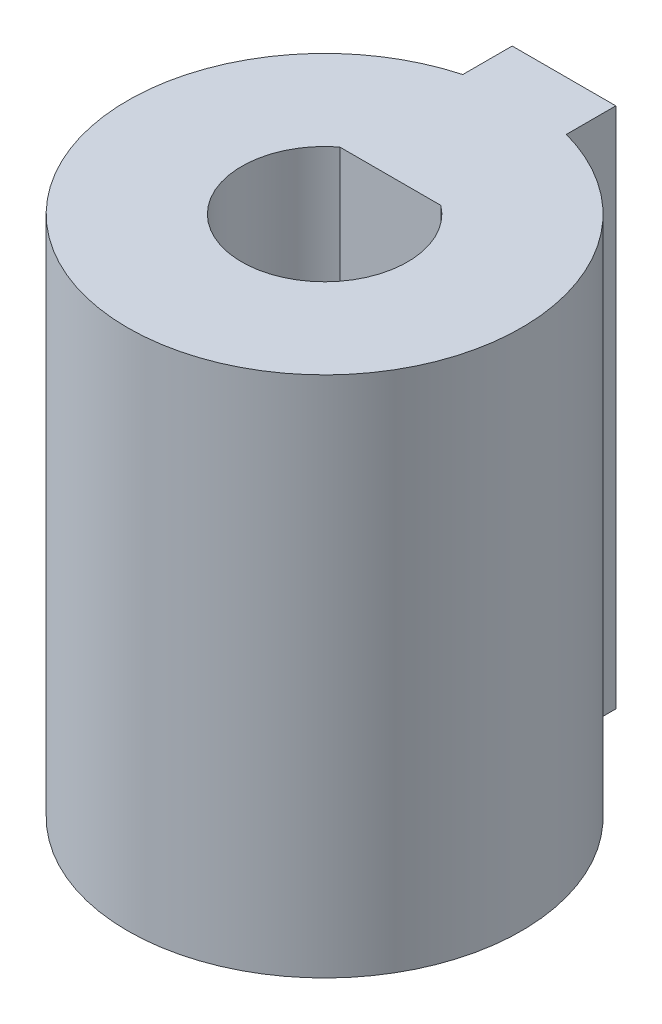
ISO-10303-21;
HEADER;
FILE_DESCRIPTION(('STEP AP214'),'2;1');
FILE_NAME('part.step','',(''),(''),'','','');
FILE_SCHEMA(('AUTOMOTIVE_DESIGN { 1 0 10303 214 1 1 1 1 }'));
ENDSEC;
DATA;
#1=APPLICATION_CONTEXT('core data for automotive mechanical design processes');
#2=APPLICATION_PROTOCOL_DEFINITION('international standard','automotive_design',2000,#1);
#3=PRODUCT_CONTEXT('',#1,'mechanical');
#4=PRODUCT('Part','Part','',(#3));
#5=PRODUCT_RELATED_PRODUCT_CATEGORY('part','',(#4));
#6=PRODUCT_DEFINITION_FORMATION('','',#4);
#7=PRODUCT_DEFINITION_CONTEXT('part definition',#1,'design');
#8=PRODUCT_DEFINITION('design','',#6,#7);
#9=PRODUCT_DEFINITION_SHAPE('','',#8);
#10=(LENGTH_UNIT() NAMED_UNIT(*) SI_UNIT(.MILLI.,.METRE.));
#11=(NAMED_UNIT(*) PLANE_ANGLE_UNIT() SI_UNIT($,.RADIAN.));
#12=(NAMED_UNIT(*) SI_UNIT($,.STERADIAN.) SOLID_ANGLE_UNIT());
#13=UNCERTAINTY_MEASURE_WITH_UNIT(LENGTH_MEASURE(1.E-05),#10,'distance_accuracy_value','');
#14=(GEOMETRIC_REPRESENTATION_CONTEXT(3) GLOBAL_UNCERTAINTY_ASSIGNED_CONTEXT((#13)) GLOBAL_UNIT_ASSIGNED_CONTEXT((#10,
#11,#12)) REPRESENTATION_CONTEXT('',''));
#15=CARTESIAN_POINT('',(0.,0.,0.));
#16=DIRECTION('',(0.,0.,1.));
#17=DIRECTION('',(1.,0.,0.));
#18=AXIS2_PLACEMENT_3D('',#15,#16,#17);
#19=CARTESIAN_POINT('',(0.,25.2,0.));
#20=DIRECTION('',(0.,1.,0.));
#21=DIRECTION('',(0.,0.,1.));
#22=AXIS2_PLACEMENT_3D('',#19,#20,#21);
#23=PLANE('',#22);
#24=DIRECTION('',(0.,0.,1.));
#25=VECTOR('',#24,1.);
#26=CARTESIAN_POINT('',(-2.5,25.2,-11.55));
#27=LINE('',#26,#25);
#28=CARTESIAN_POINT('',(-2.5,25.2,-11.55));
#29=VERTEX_POINT('',#28);
#30=CARTESIAN_POINT('',(-2.5,25.2,-9.16515138991168));
#31=VERTEX_POINT('',#30);
#32=EDGE_CURVE('E110',#29,#31,#27,.T.);
#33=ORIENTED_EDGE('',*,*,#32,.T.);
#34=CARTESIAN_POINT('',(0.,25.2,0.));
#35=DIRECTION('',(0.,1.,0.));
#36=DIRECTION('',(0.,0.,1.));
#37=AXIS2_PLACEMENT_3D('',#34,#35,#36);
#38=CIRCLE('',#37,9.5);
#39=CARTESIAN_POINT('',(2.5,25.2,-9.16515138991168));
#40=VERTEX_POINT('',#39);
#41=EDGE_CURVE('E113',#31,#40,#38,.T.);
#42=ORIENTED_EDGE('',*,*,#41,.T.);
#43=DIRECTION('',(0.,0.,-1.));
#44=VECTOR('',#43,1.);
#45=CARTESIAN_POINT('',(2.5,25.2,-11.55));
#46=LINE('',#45,#44);
#47=CARTESIAN_POINT('',(2.5,25.2,-11.55));
#48=VERTEX_POINT('',#47);
#49=EDGE_CURVE('E116',#40,#48,#46,.T.);
#50=ORIENTED_EDGE('',*,*,#49,.T.);
#51=DIRECTION('',(-1.,0.,0.));
#52=VECTOR('',#51,1.);
#53=CARTESIAN_POINT('',(-2.5,25.2,-11.55));
#54=LINE('',#53,#52);
#55=EDGE_CURVE('E118',#48,#29,#54,.T.);
#56=ORIENTED_EDGE('',*,*,#55,.T.);
#57=EDGE_LOOP('',(#33,#42,#50,#56));
#58=FACE_BOUND('',#57,.T.);
#59=DIRECTION('',(-1.,0.,0.));
#60=VECTOR('',#59,1.);
#61=CARTESIAN_POINT('',(-2.43948765112677,25.2,-3.17));
#62=LINE('',#61,#60);
#63=CARTESIAN_POINT('',(2.43948765112677,25.2,-3.17));
#64=VERTEX_POINT('',#63);
#65=CARTESIAN_POINT('',(-2.43948765112677,25.2,-3.17));
#66=VERTEX_POINT('',#65);
#67=EDGE_CURVE('E93',#64,#66,#62,.T.);
#68=ORIENTED_EDGE('',*,*,#67,.F.);
#69=CARTESIAN_POINT('',(0.,25.2,0.));
#70=DIRECTION('',(0.,1.,0.));
#71=DIRECTION('',(0.,0.,1.));
#72=AXIS2_PLACEMENT_3D('',#69,#70,#71);
#73=CIRCLE('',#72,4.);
#74=EDGE_CURVE('E99',#66,#64,#73,.T.);
#75=ORIENTED_EDGE('',*,*,#74,.F.);
#76=EDGE_LOOP('',(#68,#75));
#77=FACE_BOUND('',#76,.T.);
#78=ADVANCED_FACE('F41',(#58,#77),#23,.T.);
#79=CARTESIAN_POINT('',(0.,0.,0.));
#80=DIRECTION('',(0.,1.,0.));
#81=DIRECTION('',(0.,0.,1.));
#82=AXIS2_PLACEMENT_3D('',#79,#80,#81);
#83=PLANE('',#82);
#84=DIRECTION('',(0.,0.,1.));
#85=VECTOR('',#84,1.);
#86=CARTESIAN_POINT('',(-2.5,0.,-11.55));
#87=LINE('',#86,#85);
#88=CARTESIAN_POINT('',(-2.5,0.,-11.55));
#89=VERTEX_POINT('',#88);
#90=CARTESIAN_POINT('',(-2.5,0.,-9.16515138991168));
#91=VERTEX_POINT('',#90);
#92=EDGE_CURVE('E109',#89,#91,#87,.T.);
#93=ORIENTED_EDGE('',*,*,#92,.F.);
#94=DIRECTION('',(-1.,0.,0.));
#95=VECTOR('',#94,1.);
#96=CARTESIAN_POINT('',(-2.5,0.,-11.55));
#97=LINE('',#96,#95);
#98=CARTESIAN_POINT('',(2.5,0.,-11.55));
#99=VERTEX_POINT('',#98);
#100=EDGE_CURVE('E114',#99,#89,#97,.T.);
#101=ORIENTED_EDGE('',*,*,#100,.F.);
#102=DIRECTION('',(0.,0.,-1.));
#103=VECTOR('',#102,1.);
#104=CARTESIAN_POINT('',(2.5,0.,-11.55));
#105=LINE('',#104,#103);
#106=CARTESIAN_POINT('',(2.5,0.,-9.16515138991168));
#107=VERTEX_POINT('',#106);
#108=EDGE_CURVE('E125',#107,#99,#105,.T.);
#109=ORIENTED_EDGE('',*,*,#108,.F.);
#110=CARTESIAN_POINT('',(0.,0.,0.));
#111=DIRECTION('',(0.,1.,0.));
#112=DIRECTION('',(0.,0.,1.));
#113=AXIS2_PLACEMENT_3D('',#110,#111,#112);
#114=CIRCLE('',#113,9.5);
#115=EDGE_CURVE('E123',#91,#107,#114,.T.);
#116=ORIENTED_EDGE('',*,*,#115,.F.);
#117=EDGE_LOOP('',(#93,#101,#109,#116));
#118=FACE_BOUND('',#117,.T.);
#119=CARTESIAN_POINT('',(0.,0.,0.));
#120=DIRECTION('',(0.,1.,0.));
#121=DIRECTION('',(0.,0.,1.));
#122=AXIS2_PLACEMENT_3D('',#119,#120,#121);
#123=CIRCLE('',#122,4.);
#124=CARTESIAN_POINT('',(-2.43948765112677,0.,-3.17));
#125=VERTEX_POINT('',#124);
#126=CARTESIAN_POINT('',(2.43948765112677,0.,-3.17));
#127=VERTEX_POINT('',#126);
#128=EDGE_CURVE('E63',#125,#127,#123,.T.);
#129=ORIENTED_EDGE('',*,*,#128,.T.);
#130=DIRECTION('',(-1.,0.,0.));
#131=VECTOR('',#130,1.);
#132=CARTESIAN_POINT('',(-2.43948765112677,0.,-3.17));
#133=LINE('',#132,#131);
#134=EDGE_CURVE('E103',#127,#125,#133,.T.);
#135=ORIENTED_EDGE('',*,*,#134,.T.);
#136=EDGE_LOOP('',(#129,#135));
#137=FACE_BOUND('',#136,.T.);
#138=ADVANCED_FACE('F143',(#118,#137),#83,.F.);
#139=CARTESIAN_POINT('',(-2.5,25.2,-11.55));
#140=DIRECTION('',(1.,0.,0.));
#141=DIRECTION('',(0.,0.,-1.));
#142=AXIS2_PLACEMENT_3D('',#139,#140,#141);
#143=PLANE('',#142);
#144=ORIENTED_EDGE('',*,*,#92,.T.);
#145=DIRECTION('',(0.,-1.,0.));
#146=VECTOR('',#145,1.);
#147=CARTESIAN_POINT('',(-2.5,25.2,-9.16515138991168));
#148=LINE('',#147,#146);
#149=EDGE_CURVE('E11',#31,#91,#148,.T.);
#150=ORIENTED_EDGE('',*,*,#149,.F.);
#151=ORIENTED_EDGE('',*,*,#32,.F.);
#152=DIRECTION('',(0.,-1.,0.));
#153=VECTOR('',#152,1.);
#154=CARTESIAN_POINT('',(-2.5,25.2,-11.55));
#155=LINE('',#154,#153);
#156=EDGE_CURVE('E120',#29,#89,#155,.T.);
#157=ORIENTED_EDGE('',*,*,#156,.T.);
#158=EDGE_LOOP('',(#144,#150,#151,#157));
#159=FACE_BOUND('',#158,.T.);
#160=ADVANCED_FACE('F43',(#159),#143,.F.);
#161=CARTESIAN_POINT('',(0.,25.2,0.));
#162=DIRECTION('',(0.,-1.,0.));
#163=DIRECTION('',(0.,0.,-1.));
#164=AXIS2_PLACEMENT_3D('',#161,#162,#163);
#165=CYLINDRICAL_SURFACE('',#164,9.5);
#166=ORIENTED_EDGE('',*,*,#115,.T.);
#167=DIRECTION('',(0.,-1.,0.));
#168=VECTOR('',#167,1.);
#169=CARTESIAN_POINT('',(2.5,25.2,-9.16515138991168));
#170=LINE('',#169,#168);
#171=EDGE_CURVE('E49',#40,#107,#170,.T.);
#172=ORIENTED_EDGE('',*,*,#171,.F.);
#173=ORIENTED_EDGE('',*,*,#41,.F.);
#174=ORIENTED_EDGE('',*,*,#149,.T.);
#175=EDGE_LOOP('',(#166,#172,#173,#174));
#176=FACE_BOUND('',#175,.T.);
#177=ADVANCED_FACE('F153',(#176),#165,.T.);
#178=CARTESIAN_POINT('',(2.5,25.2,-11.55));
#179=DIRECTION('',(-1.,0.,0.));
#180=DIRECTION('',(0.,0.,1.));
#181=AXIS2_PLACEMENT_3D('',#178,#179,#180);
#182=PLANE('',#181);
#183=ORIENTED_EDGE('',*,*,#108,.T.);
#184=DIRECTION('',(0.,-1.,0.));
#185=VECTOR('',#184,1.);
#186=CARTESIAN_POINT('',(2.5,25.2,-11.55));
#187=LINE('',#186,#185);
#188=EDGE_CURVE('E130',#48,#99,#187,.T.);
#189=ORIENTED_EDGE('',*,*,#188,.F.);
#190=ORIENTED_EDGE('',*,*,#49,.F.);
#191=ORIENTED_EDGE('',*,*,#171,.T.);
#192=EDGE_LOOP('',(#183,#189,#190,#191));
#193=FACE_BOUND('',#192,.T.);
#194=ADVANCED_FACE('F137',(#193),#182,.F.);
#195=CARTESIAN_POINT('',(-2.5,25.2,-11.55));
#196=DIRECTION('',(0.,0.,1.));
#197=DIRECTION('',(1.,0.,0.));
#198=AXIS2_PLACEMENT_3D('',#195,#196,#197);
#199=PLANE('',#198);
#200=ORIENTED_EDGE('',*,*,#100,.T.);
#201=ORIENTED_EDGE('',*,*,#156,.F.);
#202=ORIENTED_EDGE('',*,*,#55,.F.);
#203=ORIENTED_EDGE('',*,*,#188,.T.);
#204=EDGE_LOOP('',(#200,#201,#202,#203));
#205=FACE_BOUND('',#204,.T.);
#206=ADVANCED_FACE('F147',(#205),#199,.F.);
#207=CARTESIAN_POINT('',(0.,25.2,0.));
#208=DIRECTION('',(0.,-1.,0.));
#209=DIRECTION('',(0.,0.,-1.));
#210=AXIS2_PLACEMENT_3D('',#207,#208,#209);
#211=CYLINDRICAL_SURFACE('',#210,4.);
#212=ORIENTED_EDGE('',*,*,#128,.F.);
#213=DIRECTION('',(0.,-1.,0.));
#214=VECTOR('',#213,1.);
#215=CARTESIAN_POINT('',(-2.43948765112677,25.2,-3.17));
#216=LINE('',#215,#214);
#217=EDGE_CURVE('E95',#66,#125,#216,.T.);
#218=ORIENTED_EDGE('',*,*,#217,.F.);
#219=ORIENTED_EDGE('',*,*,#74,.T.);
#220=DIRECTION('',(0.,-1.,0.));
#221=VECTOR('',#220,1.);
#222=CARTESIAN_POINT('',(2.43948765112677,25.2,-3.17));
#223=LINE('',#222,#221);
#224=EDGE_CURVE('E56',#64,#127,#223,.T.);
#225=ORIENTED_EDGE('',*,*,#224,.T.);
#226=EDGE_LOOP('',(#212,#218,#219,#225));
#227=FACE_BOUND('',#226,.T.);
#228=ADVANCED_FACE('F101',(#227),#211,.F.);
#229=CARTESIAN_POINT('',(-2.43948765112677,25.2,-3.17));
#230=DIRECTION('',(0.,0.,1.));
#231=DIRECTION('',(1.,0.,0.));
#232=AXIS2_PLACEMENT_3D('',#229,#230,#231);
#233=PLANE('',#232);
#234=ORIENTED_EDGE('',*,*,#134,.F.);
#235=ORIENTED_EDGE('',*,*,#224,.F.);
#236=ORIENTED_EDGE('',*,*,#67,.T.);
#237=ORIENTED_EDGE('',*,*,#217,.T.);
#238=EDGE_LOOP('',(#234,#235,#236,#237));
#239=FACE_BOUND('',#238,.T.);
#240=ADVANCED_FACE('F94',(#239),#233,.T.);
#241=CLOSED_SHELL('',(#78,#138,#160,#177,#194,#206,#228,#240));
#242=MANIFOLD_SOLID_BREP('B2',#241);
#243=ADVANCED_BREP_SHAPE_REPRESENTATION('',(#18,#242),#14);
#244=SHAPE_DEFINITION_REPRESENTATION(#9,#243);
ENDSEC;
END-ISO-10303-21;
